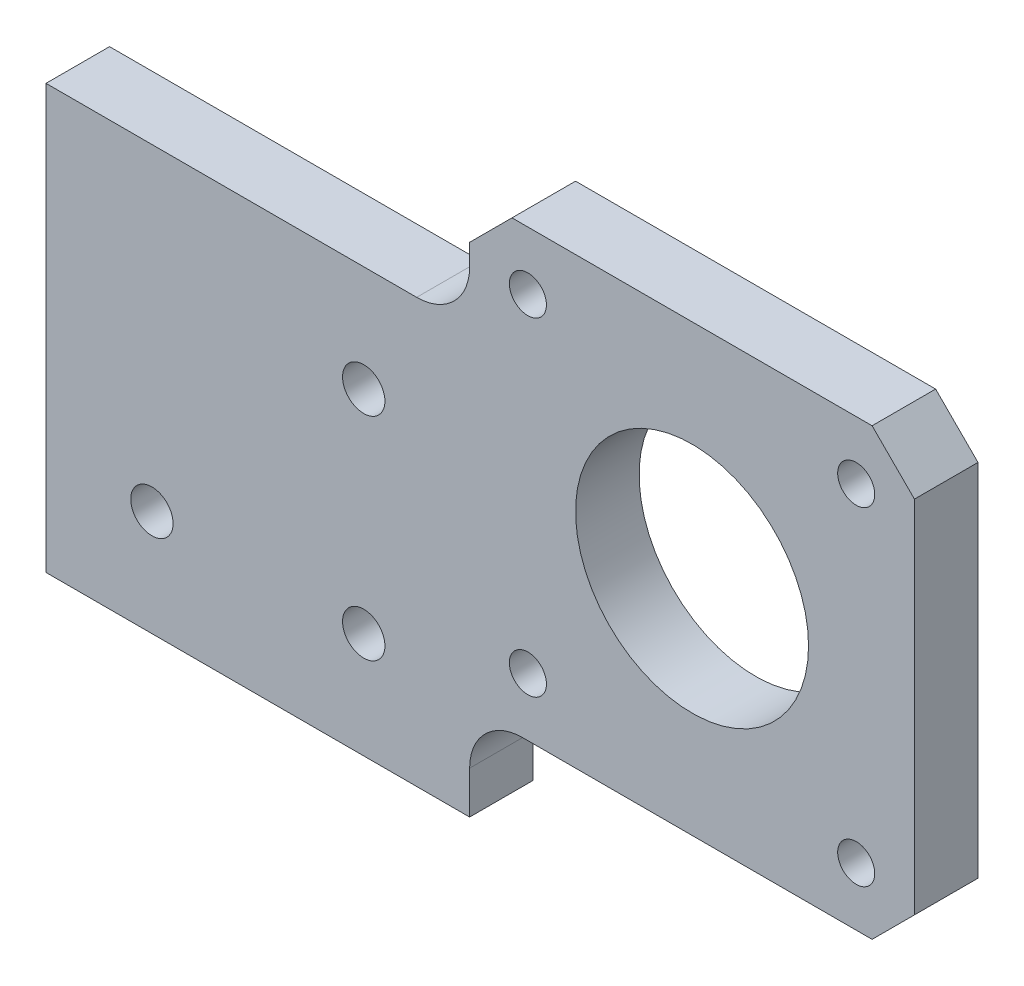
ISO-10303-21;
HEADER;
FILE_DESCRIPTION(('STEP AP214'),'2;1');
FILE_NAME('part.step','',(''),(''),'','','');
FILE_SCHEMA(('AUTOMOTIVE_DESIGN { 1 0 10303 214 1 1 1 1 }'));
ENDSEC;
DATA;
#1=APPLICATION_CONTEXT('core data for automotive mechanical design processes');
#2=APPLICATION_PROTOCOL_DEFINITION('international standard','automotive_design',2000,#1);
#3=PRODUCT_CONTEXT('',#1,'mechanical');
#4=PRODUCT('Part','Part','',(#3));
#5=PRODUCT_RELATED_PRODUCT_CATEGORY('part','',(#4));
#6=PRODUCT_DEFINITION_FORMATION('','',#4);
#7=PRODUCT_DEFINITION_CONTEXT('part definition',#1,'design');
#8=PRODUCT_DEFINITION('design','',#6,#7);
#9=PRODUCT_DEFINITION_SHAPE('','',#8);
#10=(LENGTH_UNIT() NAMED_UNIT(*) SI_UNIT(.MILLI.,.METRE.));
#11=(NAMED_UNIT(*) PLANE_ANGLE_UNIT() SI_UNIT($,.RADIAN.));
#12=(NAMED_UNIT(*) SI_UNIT($,.STERADIAN.) SOLID_ANGLE_UNIT());
#13=UNCERTAINTY_MEASURE_WITH_UNIT(LENGTH_MEASURE(1.E-05),#10,'distance_accuracy_value','');
#14=(GEOMETRIC_REPRESENTATION_CONTEXT(3) GLOBAL_UNCERTAINTY_ASSIGNED_CONTEXT((#13)) GLOBAL_UNIT_ASSIGNED_CONTEXT((#10,
#11,#12)) REPRESENTATION_CONTEXT('',''));
#15=CARTESIAN_POINT('',(0.,0.,0.));
#16=DIRECTION('',(0.,0.,1.));
#17=DIRECTION('',(1.,0.,0.));
#18=AXIS2_PLACEMENT_3D('',#15,#16,#17);
#19=CARTESIAN_POINT('',(0.,0.,6.));
#20=DIRECTION('',(0.,1.,0.));
#21=DIRECTION('',(0.,0.,1.));
#22=AXIS2_PLACEMENT_3D('',#19,#20,#21);
#23=PLANE('',#22);
#24=DIRECTION('',(1.,0.,0.));
#25=VECTOR('',#24,1.);
#26=CARTESIAN_POINT('',(0.,0.,0.));
#27=LINE('',#26,#25);
#28=CARTESIAN_POINT('',(0.,0.,0.));
#29=VERTEX_POINT('',#28);
#30=CARTESIAN_POINT('',(40.,0.,0.));
#31=VERTEX_POINT('',#30);
#32=EDGE_CURVE('E154',#29,#31,#27,.T.);
#33=ORIENTED_EDGE('',*,*,#32,.T.);
#34=DIRECTION('',(0.,0.,-1.));
#35=VECTOR('',#34,1.);
#36=CARTESIAN_POINT('',(40.,0.,6.));
#37=LINE('',#36,#35);
#38=CARTESIAN_POINT('',(40.,0.,6.));
#39=VERTEX_POINT('',#38);
#40=EDGE_CURVE('E133',#39,#31,#37,.T.);
#41=ORIENTED_EDGE('',*,*,#40,.F.);
#42=DIRECTION('',(1.,0.,0.));
#43=VECTOR('',#42,1.);
#44=CARTESIAN_POINT('',(0.,0.,6.));
#45=LINE('',#44,#43);
#46=CARTESIAN_POINT('',(0.,0.,6.));
#47=VERTEX_POINT('',#46);
#48=EDGE_CURVE('E140',#47,#39,#45,.T.);
#49=ORIENTED_EDGE('',*,*,#48,.F.);
#50=DIRECTION('',(0.,0.,-1.));
#51=VECTOR('',#50,1.);
#52=CARTESIAN_POINT('',(0.,0.,6.));
#53=LINE('',#52,#51);
#54=EDGE_CURVE('E161',#47,#29,#53,.T.);
#55=ORIENTED_EDGE('',*,*,#54,.T.);
#56=EDGE_LOOP('',(#33,#41,#49,#55));
#57=FACE_BOUND('',#56,.T.);
#58=ADVANCED_FACE('F35',(#57),#23,.F.);
#59=CARTESIAN_POINT('',(40.,0.,6.));
#60=DIRECTION('',(-1.,0.,0.));
#61=DIRECTION('',(0.,0.,1.));
#62=AXIS2_PLACEMENT_3D('',#59,#60,#61);
#63=PLANE('',#62);
#64=DIRECTION('',(0.,1.,0.));
#65=VECTOR('',#64,1.);
#66=CARTESIAN_POINT('',(40.,0.,0.));
#67=LINE('',#66,#65);
#68=CARTESIAN_POINT('',(40.,3.99999999999999,0.));
#69=VERTEX_POINT('',#68);
#70=EDGE_CURVE('E215',#31,#69,#67,.T.);
#71=ORIENTED_EDGE('',*,*,#70,.T.);
#72=DIRECTION('',(0.,0.,-1.));
#73=VECTOR('',#72,1.);
#74=CARTESIAN_POINT('',(40.,3.99999999999999,6.));
#75=LINE('',#74,#73);
#76=CARTESIAN_POINT('',(40.,3.99999999999999,6.));
#77=VERTEX_POINT('',#76);
#78=EDGE_CURVE('E136',#69,#77,#75,.F.);
#79=ORIENTED_EDGE('',*,*,#78,.T.);
#80=DIRECTION('',(0.,1.,0.));
#81=VECTOR('',#80,1.);
#82=CARTESIAN_POINT('',(40.,0.,6.));
#83=LINE('',#82,#81);
#84=EDGE_CURVE('E128',#39,#77,#83,.T.);
#85=ORIENTED_EDGE('',*,*,#84,.F.);
#86=ORIENTED_EDGE('',*,*,#40,.T.);
#87=EDGE_LOOP('',(#71,#79,#85,#86));
#88=FACE_BOUND('',#87,.T.);
#89=ADVANCED_FACE('F131',(#88),#63,.F.);
#90=CARTESIAN_POINT('',(0.,8.99999999999998,6.));
#91=DIRECTION('',(0.,1.,0.));
#92=DIRECTION('',(-1.,0.,0.));
#93=AXIS2_PLACEMENT_3D('',#90,#91,#92);
#94=PLANE('',#93);
#95=DIRECTION('',(1.,0.,0.));
#96=VECTOR('',#95,1.);
#97=CARTESIAN_POINT('',(0.,8.99999999999998,6.));
#98=LINE('',#97,#96);
#99=CARTESIAN_POINT('',(45.,8.99999999999999,6.));
#100=VERTEX_POINT('',#99);
#101=CARTESIAN_POINT('',(78.,8.99999999999999,6.));
#102=VERTEX_POINT('',#101);
#103=EDGE_CURVE('E139',#100,#102,#98,.T.);
#104=ORIENTED_EDGE('',*,*,#103,.F.);
#105=DIRECTION('',(0.,0.,-1.));
#106=VECTOR('',#105,1.);
#107=CARTESIAN_POINT('',(45.,8.99999999999999,0.));
#108=LINE('',#107,#106);
#109=CARTESIAN_POINT('',(45.,8.99999999999999,0.));
#110=VERTEX_POINT('',#109);
#111=EDGE_CURVE('E191',#100,#110,#108,.T.);
#112=ORIENTED_EDGE('',*,*,#111,.T.);
#113=DIRECTION('',(1.,0.,0.));
#114=VECTOR('',#113,1.);
#115=CARTESIAN_POINT('',(0.,8.99999999999998,0.));
#116=LINE('',#115,#114);
#117=CARTESIAN_POINT('',(78.,8.99999999999999,0.));
#118=VERTEX_POINT('',#117);
#119=EDGE_CURVE('E216',#110,#118,#116,.T.);
#120=ORIENTED_EDGE('',*,*,#119,.T.);
#121=DIRECTION('',(0.,0.,1.));
#122=VECTOR('',#121,1.);
#123=CARTESIAN_POINT('',(78.,8.99999999999999,6.));
#124=LINE('',#123,#122);
#125=EDGE_CURVE('E188',#118,#102,#124,.T.);
#126=ORIENTED_EDGE('',*,*,#125,.T.);
#127=EDGE_LOOP('',(#104,#112,#120,#126));
#128=FACE_BOUND('',#127,.T.);
#129=ADVANCED_FACE('F206',(#128),#94,.F.);
#130=CARTESIAN_POINT('',(82.,0.,6.));
#131=DIRECTION('',(-1.,0.,0.));
#132=DIRECTION('',(0.,-1.,0.));
#133=AXIS2_PLACEMENT_3D('',#130,#131,#132);
#134=PLANE('',#133);
#135=DIRECTION('',(0.,1.,0.));
#136=VECTOR('',#135,1.);
#137=CARTESIAN_POINT('',(82.,0.,6.));
#138=LINE('',#137,#136);
#139=CARTESIAN_POINT('',(82.,13.,6.));
#140=VERTEX_POINT('',#139);
#141=CARTESIAN_POINT('',(82.,47.,6.));
#142=VERTEX_POINT('',#141);
#143=EDGE_CURVE('E210',#140,#142,#138,.T.);
#144=ORIENTED_EDGE('',*,*,#143,.F.);
#145=DIRECTION('',(0.,0.,-1.));
#146=VECTOR('',#145,1.);
#147=CARTESIAN_POINT('',(82.,13.,6.));
#148=LINE('',#147,#146);
#149=CARTESIAN_POINT('',(82.,13.,0.));
#150=VERTEX_POINT('',#149);
#151=EDGE_CURVE('E185',#140,#150,#148,.T.);
#152=ORIENTED_EDGE('',*,*,#151,.T.);
#153=DIRECTION('',(0.,1.,0.));
#154=VECTOR('',#153,1.);
#155=CARTESIAN_POINT('',(82.,0.,0.));
#156=LINE('',#155,#154);
#157=CARTESIAN_POINT('',(82.,47.,0.));
#158=VERTEX_POINT('',#157);
#159=EDGE_CURVE('E218',#150,#158,#156,.T.);
#160=ORIENTED_EDGE('',*,*,#159,.T.);
#161=DIRECTION('',(0.,0.,1.));
#162=VECTOR('',#161,1.);
#163=CARTESIAN_POINT('',(82.,47.,6.));
#164=LINE('',#163,#162);
#165=EDGE_CURVE('E183',#158,#142,#164,.T.);
#166=ORIENTED_EDGE('',*,*,#165,.T.);
#167=EDGE_LOOP('',(#144,#152,#160,#166));
#168=FACE_BOUND('',#167,.T.);
#169=ADVANCED_FACE('F298',(#168),#134,.F.);
#170=CARTESIAN_POINT('',(0.,51.,6.));
#171=DIRECTION('',(0.,1.,0.));
#172=DIRECTION('',(0.,0.,1.));
#173=AXIS2_PLACEMENT_3D('',#170,#171,#172);
#174=PLANE('',#173);
#175=DIRECTION('',(1.,0.,0.));
#176=VECTOR('',#175,1.);
#177=CARTESIAN_POINT('',(0.,51.,0.));
#178=LINE('',#177,#176);
#179=CARTESIAN_POINT('',(44.,51.,0.));
#180=VERTEX_POINT('',#179);
#181=CARTESIAN_POINT('',(77.9999999999999,51.,0.));
#182=VERTEX_POINT('',#181);
#183=EDGE_CURVE('E226',#180,#182,#178,.T.);
#184=ORIENTED_EDGE('',*,*,#183,.F.);
#185=DIRECTION('',(0.,0.,1.));
#186=VECTOR('',#185,1.);
#187=CARTESIAN_POINT('',(44.,51.,6.));
#188=LINE('',#187,#186);
#189=CARTESIAN_POINT('',(44.,51.,6.));
#190=VERTEX_POINT('',#189);
#191=EDGE_CURVE('E174',#180,#190,#188,.T.);
#192=ORIENTED_EDGE('',*,*,#191,.T.);
#193=DIRECTION('',(1.,0.,0.));
#194=VECTOR('',#193,1.);
#195=CARTESIAN_POINT('',(0.,51.,6.));
#196=LINE('',#195,#194);
#197=CARTESIAN_POINT('',(77.9999999999999,51.,6.));
#198=VERTEX_POINT('',#197);
#199=EDGE_CURVE('E353',#190,#198,#196,.T.);
#200=ORIENTED_EDGE('',*,*,#199,.T.);
#201=DIRECTION('',(0.,0.,-1.));
#202=VECTOR('',#201,1.);
#203=CARTESIAN_POINT('',(77.9999999999999,51.,0.));
#204=LINE('',#203,#202);
#205=EDGE_CURVE('E171',#198,#182,#204,.T.);
#206=ORIENTED_EDGE('',*,*,#205,.T.);
#207=EDGE_LOOP('',(#184,#192,#200,#206));
#208=FACE_BOUND('',#207,.T.);
#209=ADVANCED_FACE('F301',(#208),#174,.T.);
#210=CARTESIAN_POINT('',(40.,0.,6.));
#211=DIRECTION('',(-1.,0.,0.));
#212=DIRECTION('',(0.,-1.,0.));
#213=AXIS2_PLACEMENT_3D('',#210,#211,#212);
#214=PLANE('',#213);
#215=DIRECTION('',(0.,1.,0.));
#216=VECTOR('',#215,1.);
#217=CARTESIAN_POINT('',(40.,0.,0.));
#218=LINE('',#217,#216);
#219=CARTESIAN_POINT('',(40.,45.,0.));
#220=VERTEX_POINT('',#219);
#221=CARTESIAN_POINT('',(40.,47.,0.));
#222=VERTEX_POINT('',#221);
#223=EDGE_CURVE('E229',#220,#222,#218,.T.);
#224=ORIENTED_EDGE('',*,*,#223,.F.);
#225=DIRECTION('',(0.,0.,-1.));
#226=VECTOR('',#225,1.);
#227=CARTESIAN_POINT('',(40.,45.,6.));
#228=LINE('',#227,#226);
#229=CARTESIAN_POINT('',(40.,45.,6.));
#230=VERTEX_POINT('',#229);
#231=EDGE_CURVE('E56',#220,#230,#228,.F.);
#232=ORIENTED_EDGE('',*,*,#231,.T.);
#233=DIRECTION('',(0.,1.,0.));
#234=VECTOR('',#233,1.);
#235=CARTESIAN_POINT('',(40.,0.,6.));
#236=LINE('',#235,#234);
#237=CARTESIAN_POINT('',(40.,47.,6.));
#238=VERTEX_POINT('',#237);
#239=EDGE_CURVE('E356',#230,#238,#236,.T.);
#240=ORIENTED_EDGE('',*,*,#239,.T.);
#241=DIRECTION('',(0.,0.,-1.));
#242=VECTOR('',#241,1.);
#243=CARTESIAN_POINT('',(40.,47.,6.));
#244=LINE('',#243,#242);
#245=EDGE_CURVE('E155',#238,#222,#244,.T.);
#246=ORIENTED_EDGE('',*,*,#245,.T.);
#247=EDGE_LOOP('',(#224,#232,#240,#246));
#248=FACE_BOUND('',#247,.T.);
#249=ADVANCED_FACE('F305',(#248),#214,.T.);
#250=CARTESIAN_POINT('',(0.,40.,6.));
#251=DIRECTION('',(0.,1.,0.));
#252=DIRECTION('',(0.,0.,1.));
#253=AXIS2_PLACEMENT_3D('',#250,#251,#252);
#254=PLANE('',#253);
#255=DIRECTION('',(1.,0.,0.));
#256=VECTOR('',#255,1.);
#257=CARTESIAN_POINT('',(0.,40.,6.));
#258=LINE('',#257,#256);
#259=CARTESIAN_POINT('',(0.,40.,6.));
#260=VERTEX_POINT('',#259);
#261=CARTESIAN_POINT('',(35.,40.,6.));
#262=VERTEX_POINT('',#261);
#263=EDGE_CURVE('E358',#260,#262,#258,.T.);
#264=ORIENTED_EDGE('',*,*,#263,.T.);
#265=DIRECTION('',(0.,0.,-1.));
#266=VECTOR('',#265,1.);
#267=CARTESIAN_POINT('',(35.,40.,0.));
#268=LINE('',#267,#266);
#269=CARTESIAN_POINT('',(35.,40.,0.));
#270=VERTEX_POINT('',#269);
#271=EDGE_CURVE('E195',#262,#270,#268,.T.);
#272=ORIENTED_EDGE('',*,*,#271,.T.);
#273=DIRECTION('',(1.,0.,0.));
#274=VECTOR('',#273,1.);
#275=CARTESIAN_POINT('',(0.,40.,0.));
#276=LINE('',#275,#274);
#277=CARTESIAN_POINT('',(0.,40.,0.));
#278=VERTEX_POINT('',#277);
#279=EDGE_CURVE('E231',#278,#270,#276,.T.);
#280=ORIENTED_EDGE('',*,*,#279,.F.);
#281=DIRECTION('',(0.,0.,-1.));
#282=VECTOR('',#281,1.);
#283=CARTESIAN_POINT('',(0.,40.,6.));
#284=LINE('',#283,#282);
#285=EDGE_CURVE('E156',#260,#278,#284,.T.);
#286=ORIENTED_EDGE('',*,*,#285,.F.);
#287=EDGE_LOOP('',(#264,#272,#280,#286));
#288=FACE_BOUND('',#287,.T.);
#289=ADVANCED_FACE('F309',(#288),#254,.T.);
#290=CARTESIAN_POINT('',(76.5,45.5,6.));
#291=DIRECTION('',(0.,0.,-1.));
#292=DIRECTION('',(-1.,0.,0.));
#293=AXIS2_PLACEMENT_3D('',#290,#291,#292);
#294=CYLINDRICAL_SURFACE('',#293,1.75);
#295=CARTESIAN_POINT('',(76.5,45.5,6.));
#296=DIRECTION('',(0.,0.,1.));
#297=DIRECTION('',(1.,0.,0.));
#298=AXIS2_PLACEMENT_3D('',#295,#296,#297);
#299=CIRCLE('',#298,1.75);
#300=CARTESIAN_POINT('',(78.25,45.5,6.));
#301=VERTEX_POINT('',#300);
#302=EDGE_CURVE('E253',#301,#301,#299,.T.);
#303=ORIENTED_EDGE('',*,*,#302,.T.);
#304=EDGE_LOOP('',(#303));
#305=FACE_BOUND('',#304,.T.);
#306=CARTESIAN_POINT('',(76.5,45.5,0.));
#307=DIRECTION('',(0.,0.,1.));
#308=DIRECTION('',(1.,0.,0.));
#309=AXIS2_PLACEMENT_3D('',#306,#307,#308);
#310=CIRCLE('',#309,1.75);
#311=CARTESIAN_POINT('',(78.25,45.5,0.));
#312=VERTEX_POINT('',#311);
#313=EDGE_CURVE('E245',#312,#312,#310,.T.);
#314=ORIENTED_EDGE('',*,*,#313,.F.);
#315=EDGE_LOOP('',(#314));
#316=FACE_BOUND('',#315,.T.);
#317=ADVANCED_FACE('F311',(#305,#316),#294,.F.);
#318=CARTESIAN_POINT('',(76.5,14.5,6.));
#319=DIRECTION('',(0.,0.,-1.));
#320=DIRECTION('',(-1.,0.,0.));
#321=AXIS2_PLACEMENT_3D('',#318,#319,#320);
#322=CYLINDRICAL_SURFACE('',#321,1.75);
#323=CARTESIAN_POINT('',(76.5,14.5,6.));
#324=DIRECTION('',(0.,0.,1.));
#325=DIRECTION('',(1.,0.,0.));
#326=AXIS2_PLACEMENT_3D('',#323,#324,#325);
#327=CIRCLE('',#326,1.75);
#328=CARTESIAN_POINT('',(78.25,14.5,6.));
#329=VERTEX_POINT('',#328);
#330=EDGE_CURVE('E258',#329,#329,#327,.T.);
#331=ORIENTED_EDGE('',*,*,#330,.T.);
#332=EDGE_LOOP('',(#331));
#333=FACE_BOUND('',#332,.T.);
#334=CARTESIAN_POINT('',(76.5,14.5,0.));
#335=DIRECTION('',(0.,0.,1.));
#336=DIRECTION('',(1.,0.,0.));
#337=AXIS2_PLACEMENT_3D('',#334,#335,#336);
#338=CIRCLE('',#337,1.75);
#339=CARTESIAN_POINT('',(78.25,14.5,0.));
#340=VERTEX_POINT('',#339);
#341=EDGE_CURVE('E242',#340,#340,#338,.T.);
#342=ORIENTED_EDGE('',*,*,#341,.F.);
#343=EDGE_LOOP('',(#342));
#344=FACE_BOUND('',#343,.T.);
#345=ADVANCED_FACE('F320',(#333,#344),#322,.F.);
#346=CARTESIAN_POINT('',(45.5,14.5,6.));
#347=DIRECTION('',(0.,0.,-1.));
#348=DIRECTION('',(-1.,0.,0.));
#349=AXIS2_PLACEMENT_3D('',#346,#347,#348);
#350=CYLINDRICAL_SURFACE('',#349,1.75);
#351=CARTESIAN_POINT('',(45.5,14.5,6.));
#352=DIRECTION('',(0.,0.,1.));
#353=DIRECTION('',(1.,0.,0.));
#354=AXIS2_PLACEMENT_3D('',#351,#352,#353);
#355=CIRCLE('',#354,1.75);
#356=CARTESIAN_POINT('',(47.25,14.5,6.));
#357=VERTEX_POINT('',#356);
#358=EDGE_CURVE('E365',#357,#357,#355,.T.);
#359=ORIENTED_EDGE('',*,*,#358,.T.);
#360=EDGE_LOOP('',(#359));
#361=FACE_BOUND('',#360,.T.);
#362=CARTESIAN_POINT('',(45.5,14.5,0.));
#363=DIRECTION('',(0.,0.,1.));
#364=DIRECTION('',(1.,0.,0.));
#365=AXIS2_PLACEMENT_3D('',#362,#363,#364);
#366=CIRCLE('',#365,1.75);
#367=CARTESIAN_POINT('',(47.25,14.5,0.));
#368=VERTEX_POINT('',#367);
#369=EDGE_CURVE('E239',#368,#368,#366,.T.);
#370=ORIENTED_EDGE('',*,*,#369,.F.);
#371=EDGE_LOOP('',(#370));
#372=FACE_BOUND('',#371,.T.);
#373=ADVANCED_FACE('F316',(#361,#372),#350,.F.);
#374=CARTESIAN_POINT('',(61.,30.,6.));
#375=DIRECTION('',(0.,0.,-1.));
#376=DIRECTION('',(-1.,0.,0.));
#377=AXIS2_PLACEMENT_3D('',#374,#375,#376);
#378=CYLINDRICAL_SURFACE('',#377,11.);
#379=CARTESIAN_POINT('',(61.,30.,6.));
#380=DIRECTION('',(0.,0.,1.));
#381=DIRECTION('',(1.,0.,0.));
#382=AXIS2_PLACEMENT_3D('',#379,#380,#381);
#383=CIRCLE('',#382,11.);
#384=CARTESIAN_POINT('',(72.,30.,6.));
#385=VERTEX_POINT('',#384);
#386=EDGE_CURVE('E362',#385,#385,#383,.T.);
#387=ORIENTED_EDGE('',*,*,#386,.T.);
#388=EDGE_LOOP('',(#387));
#389=FACE_BOUND('',#388,.T.);
#390=CARTESIAN_POINT('',(61.,30.,0.));
#391=DIRECTION('',(0.,0.,1.));
#392=DIRECTION('',(1.,0.,0.));
#393=AXIS2_PLACEMENT_3D('',#390,#391,#392);
#394=CIRCLE('',#393,11.);
#395=CARTESIAN_POINT('',(72.,30.,0.));
#396=VERTEX_POINT('',#395);
#397=EDGE_CURVE('E236',#396,#396,#394,.T.);
#398=ORIENTED_EDGE('',*,*,#397,.F.);
#399=EDGE_LOOP('',(#398));
#400=FACE_BOUND('',#399,.T.);
#401=ADVANCED_FACE('F284',(#389,#400),#378,.F.);
#402=CARTESIAN_POINT('',(0.,0.,6.));
#403=DIRECTION('',(-1.,0.,0.));
#404=DIRECTION('',(0.,0.,1.));
#405=AXIS2_PLACEMENT_3D('',#402,#403,#404);
#406=PLANE('',#405);
#407=DIRECTION('',(0.,1.,0.));
#408=VECTOR('',#407,1.);
#409=CARTESIAN_POINT('',(0.,0.,0.));
#410=LINE('',#409,#408);
#411=EDGE_CURVE('E233',#29,#278,#410,.T.);
#412=ORIENTED_EDGE('',*,*,#411,.F.);
#413=ORIENTED_EDGE('',*,*,#54,.F.);
#414=DIRECTION('',(0.,1.,0.));
#415=VECTOR('',#414,1.);
#416=CARTESIAN_POINT('',(0.,0.,6.));
#417=LINE('',#416,#415);
#418=EDGE_CURVE('E149',#47,#260,#417,.T.);
#419=ORIENTED_EDGE('',*,*,#418,.T.);
#420=ORIENTED_EDGE('',*,*,#285,.T.);
#421=EDGE_LOOP('',(#412,#413,#419,#420));
#422=FACE_BOUND('',#421,.T.);
#423=ADVANCED_FACE('F274',(#422),#406,.T.);
#424=CARTESIAN_POINT('',(30.,10.,6.));
#425=DIRECTION('',(0.,0.,-1.));
#426=DIRECTION('',(-1.,0.,0.));
#427=AXIS2_PLACEMENT_3D('',#424,#425,#426);
#428=CYLINDRICAL_SURFACE('',#427,2.);
#429=CARTESIAN_POINT('',(30.,10.,6.));
#430=DIRECTION('',(0.,0.,1.));
#431=DIRECTION('',(1.,0.,0.));
#432=AXIS2_PLACEMENT_3D('',#429,#430,#431);
#433=CIRCLE('',#432,2.);
#434=CARTESIAN_POINT('',(32.,10.,6.));
#435=VERTEX_POINT('',#434);
#436=EDGE_CURVE('E151',#435,#435,#433,.T.);
#437=ORIENTED_EDGE('',*,*,#436,.T.);
#438=EDGE_LOOP('',(#437));
#439=FACE_BOUND('',#438,.T.);
#440=CARTESIAN_POINT('',(30.,10.,0.));
#441=DIRECTION('',(0.,0.,1.));
#442=DIRECTION('',(1.,0.,0.));
#443=AXIS2_PLACEMENT_3D('',#440,#441,#442);
#444=CIRCLE('',#443,2.);
#445=CARTESIAN_POINT('',(32.,10.,0.));
#446=VERTEX_POINT('',#445);
#447=EDGE_CURVE('E220',#446,#446,#444,.T.);
#448=ORIENTED_EDGE('',*,*,#447,.F.);
#449=EDGE_LOOP('',(#448));
#450=FACE_BOUND('',#449,.T.);
#451=ADVANCED_FACE('F271',(#439,#450),#428,.F.);
#452=CARTESIAN_POINT('',(10.,10.,6.));
#453=DIRECTION('',(0.,0.,-1.));
#454=DIRECTION('',(-1.,0.,0.));
#455=AXIS2_PLACEMENT_3D('',#452,#453,#454);
#456=CYLINDRICAL_SURFACE('',#455,2.);
#457=CARTESIAN_POINT('',(10.,10.,6.));
#458=DIRECTION('',(0.,0.,1.));
#459=DIRECTION('',(1.,0.,0.));
#460=AXIS2_PLACEMENT_3D('',#457,#458,#459);
#461=CIRCLE('',#460,2.);
#462=CARTESIAN_POINT('',(12.,10.,6.));
#463=VERTEX_POINT('',#462);
#464=EDGE_CURVE('E345',#463,#463,#461,.T.);
#465=ORIENTED_EDGE('',*,*,#464,.T.);
#466=EDGE_LOOP('',(#465));
#467=FACE_BOUND('',#466,.T.);
#468=CARTESIAN_POINT('',(10.,10.,0.));
#469=DIRECTION('',(0.,0.,1.));
#470=DIRECTION('',(1.,0.,0.));
#471=AXIS2_PLACEMENT_3D('',#468,#469,#470);
#472=CIRCLE('',#471,2.);
#473=CARTESIAN_POINT('',(12.,10.,0.));
#474=VERTEX_POINT('',#473);
#475=EDGE_CURVE('E265',#474,#474,#472,.T.);
#476=ORIENTED_EDGE('',*,*,#475,.F.);
#477=EDGE_LOOP('',(#476));
#478=FACE_BOUND('',#477,.T.);
#479=ADVANCED_FACE('F273',(#467,#478),#456,.F.);
#480=CARTESIAN_POINT('',(30.,30.,6.));
#481=DIRECTION('',(0.,0.,-1.));
#482=DIRECTION('',(-1.,0.,0.));
#483=AXIS2_PLACEMENT_3D('',#480,#481,#482);
#484=CYLINDRICAL_SURFACE('',#483,2.);
#485=CARTESIAN_POINT('',(30.,30.,6.));
#486=DIRECTION('',(0.,0.,1.));
#487=DIRECTION('',(1.,0.,0.));
#488=AXIS2_PLACEMENT_3D('',#485,#486,#487);
#489=CIRCLE('',#488,2.);
#490=CARTESIAN_POINT('',(32.,30.,6.));
#491=VERTEX_POINT('',#490);
#492=EDGE_CURVE('E250',#491,#491,#489,.T.);
#493=ORIENTED_EDGE('',*,*,#492,.T.);
#494=EDGE_LOOP('',(#493));
#495=FACE_BOUND('',#494,.T.);
#496=CARTESIAN_POINT('',(30.,30.,0.));
#497=DIRECTION('',(0.,0.,1.));
#498=DIRECTION('',(1.,0.,0.));
#499=AXIS2_PLACEMENT_3D('',#496,#497,#498);
#500=CIRCLE('',#499,2.);
#501=CARTESIAN_POINT('',(32.,30.,0.));
#502=VERTEX_POINT('',#501);
#503=EDGE_CURVE('E262',#502,#502,#500,.T.);
#504=ORIENTED_EDGE('',*,*,#503,.F.);
#505=EDGE_LOOP('',(#504));
#506=FACE_BOUND('',#505,.T.);
#507=ADVANCED_FACE('F281',(#495,#506),#484,.F.);
#508=CARTESIAN_POINT('',(45.5,45.5,6.));
#509=DIRECTION('',(0.,0.,-1.));
#510=DIRECTION('',(-1.,0.,0.));
#511=AXIS2_PLACEMENT_3D('',#508,#509,#510);
#512=CYLINDRICAL_SURFACE('',#511,1.75);
#513=CARTESIAN_POINT('',(45.5,45.5,6.));
#514=DIRECTION('',(0.,0.,1.));
#515=DIRECTION('',(1.,0.,0.));
#516=AXIS2_PLACEMENT_3D('',#513,#514,#515);
#517=CIRCLE('',#516,1.75);
#518=CARTESIAN_POINT('',(47.25,45.5,6.));
#519=VERTEX_POINT('',#518);
#520=EDGE_CURVE('E251',#519,#519,#517,.T.);
#521=ORIENTED_EDGE('',*,*,#520,.T.);
#522=EDGE_LOOP('',(#521));
#523=FACE_BOUND('',#522,.T.);
#524=CARTESIAN_POINT('',(45.5,45.5,0.));
#525=DIRECTION('',(0.,0.,1.));
#526=DIRECTION('',(1.,0.,0.));
#527=AXIS2_PLACEMENT_3D('',#524,#525,#526);
#528=CIRCLE('',#527,1.75);
#529=CARTESIAN_POINT('',(47.25,45.5,0.));
#530=VERTEX_POINT('',#529);
#531=EDGE_CURVE('E248',#530,#530,#528,.T.);
#532=ORIENTED_EDGE('',*,*,#531,.F.);
#533=EDGE_LOOP('',(#532));
#534=FACE_BOUND('',#533,.T.);
#535=ADVANCED_FACE('F328',(#523,#534),#512,.F.);
#536=CARTESIAN_POINT('',(0.,0.,6.));
#537=DIRECTION('',(0.,0.,1.));
#538=DIRECTION('',(1.,0.,0.));
#539=AXIS2_PLACEMENT_3D('',#536,#537,#538);
#540=PLANE('',#539);
#541=ORIENTED_EDGE('',*,*,#492,.F.);
#542=EDGE_LOOP('',(#541));
#543=FACE_BOUND('',#542,.T.);
#544=ORIENTED_EDGE('',*,*,#464,.F.);
#545=EDGE_LOOP('',(#544));
#546=FACE_BOUND('',#545,.T.);
#547=ORIENTED_EDGE('',*,*,#436,.F.);
#548=EDGE_LOOP('',(#547));
#549=FACE_BOUND('',#548,.T.);
#550=ORIENTED_EDGE('',*,*,#199,.F.);
#551=DIRECTION('',(0.707106781186549,0.707106781186546,0.));
#552=VECTOR('',#551,1.);
#553=CARTESIAN_POINT('',(-3.50000000000009,3.5000000000001,6.));
#554=LINE('',#553,#552);
#555=EDGE_CURVE('E180',#190,#238,#554,.F.);
#556=ORIENTED_EDGE('',*,*,#555,.T.);
#557=ORIENTED_EDGE('',*,*,#239,.F.);
#558=CARTESIAN_POINT('',(35.,45.,6.));
#559=DIRECTION('',(0.,0.,1.));
#560=DIRECTION('',(1.,0.,0.));
#561=AXIS2_PLACEMENT_3D('',#558,#559,#560);
#562=CIRCLE('',#561,5.);
#563=EDGE_CURVE('E11',#230,#262,#562,.F.);
#564=ORIENTED_EDGE('',*,*,#563,.T.);
#565=ORIENTED_EDGE('',*,*,#263,.F.);
#566=ORIENTED_EDGE('',*,*,#418,.F.);
#567=ORIENTED_EDGE('',*,*,#48,.T.);
#568=ORIENTED_EDGE('',*,*,#84,.T.);
#569=CARTESIAN_POINT('',(45.,3.99999999999999,6.));
#570=DIRECTION('',(0.,0.,1.));
#571=DIRECTION('',(1.,0.,0.));
#572=AXIS2_PLACEMENT_3D('',#569,#570,#571);
#573=CIRCLE('',#572,5.);
#574=EDGE_CURVE('E201',#77,#100,#573,.F.);
#575=ORIENTED_EDGE('',*,*,#574,.T.);
#576=ORIENTED_EDGE('',*,*,#103,.T.);
#577=DIRECTION('',(-0.707106781186549,-0.707106781186546,0.));
#578=VECTOR('',#577,1.);
#579=CARTESIAN_POINT('',(34.4999999999999,-34.5,6.));
#580=LINE('',#579,#578);
#581=EDGE_CURVE('E178',#102,#140,#580,.F.);
#582=ORIENTED_EDGE('',*,*,#581,.T.);
#583=ORIENTED_EDGE('',*,*,#143,.T.);
#584=DIRECTION('',(-0.707106781186546,0.707106781186549,0.));
#585=VECTOR('',#584,1.);
#586=CARTESIAN_POINT('',(64.5000000000001,64.4999999999999,6.));
#587=LINE('',#586,#585);
#588=EDGE_CURVE('E176',#142,#198,#587,.T.);
#589=ORIENTED_EDGE('',*,*,#588,.T.);
#590=EDGE_LOOP('',(#550,#556,#557,#564,#565,#566,#567,#568,#575,#576,#582,#583,#589));
#591=FACE_BOUND('',#590,.T.);
#592=ORIENTED_EDGE('',*,*,#386,.F.);
#593=EDGE_LOOP('',(#592));
#594=FACE_BOUND('',#593,.T.);
#595=ORIENTED_EDGE('',*,*,#358,.F.);
#596=EDGE_LOOP('',(#595));
#597=FACE_BOUND('',#596,.T.);
#598=ORIENTED_EDGE('',*,*,#330,.F.);
#599=EDGE_LOOP('',(#598));
#600=FACE_BOUND('',#599,.T.);
#601=ORIENTED_EDGE('',*,*,#302,.F.);
#602=EDGE_LOOP('',(#601));
#603=FACE_BOUND('',#602,.T.);
#604=ORIENTED_EDGE('',*,*,#520,.F.);
#605=EDGE_LOOP('',(#604));
#606=FACE_BOUND('',#605,.T.);
#607=ADVANCED_FACE('F145',(#543,#546,#549,#591,#594,#597,#600,#603,#606),#540,.T.);
#608=CARTESIAN_POINT('',(0.,0.,0.));
#609=DIRECTION('',(0.,0.,1.));
#610=DIRECTION('',(1.,0.,0.));
#611=AXIS2_PLACEMENT_3D('',#608,#609,#610);
#612=PLANE('',#611);
#613=ORIENTED_EDGE('',*,*,#503,.T.);
#614=EDGE_LOOP('',(#613));
#615=FACE_BOUND('',#614,.T.);
#616=ORIENTED_EDGE('',*,*,#475,.T.);
#617=EDGE_LOOP('',(#616));
#618=FACE_BOUND('',#617,.T.);
#619=ORIENTED_EDGE('',*,*,#447,.T.);
#620=EDGE_LOOP('',(#619));
#621=FACE_BOUND('',#620,.T.);
#622=ORIENTED_EDGE('',*,*,#279,.T.);
#623=CARTESIAN_POINT('',(35.,45.,0.));
#624=DIRECTION('',(0.,0.,1.));
#625=DIRECTION('',(1.,0.,0.));
#626=AXIS2_PLACEMENT_3D('',#623,#624,#625);
#627=CIRCLE('',#626,5.);
#628=EDGE_CURVE('E43',#270,#220,#627,.T.);
#629=ORIENTED_EDGE('',*,*,#628,.T.);
#630=ORIENTED_EDGE('',*,*,#223,.T.);
#631=DIRECTION('',(-0.707106781186549,-0.707106781186546,0.));
#632=VECTOR('',#631,1.);
#633=CARTESIAN_POINT('',(40.,47.,0.));
#634=LINE('',#633,#632);
#635=EDGE_CURVE('E169',#222,#180,#634,.F.);
#636=ORIENTED_EDGE('',*,*,#635,.T.);
#637=ORIENTED_EDGE('',*,*,#183,.T.);
#638=DIRECTION('',(0.707106781186546,-0.707106781186549,0.));
#639=VECTOR('',#638,1.);
#640=CARTESIAN_POINT('',(77.9999999999999,51.,0.));
#641=LINE('',#640,#639);
#642=EDGE_CURVE('E159',#182,#158,#641,.T.);
#643=ORIENTED_EDGE('',*,*,#642,.T.);
#644=ORIENTED_EDGE('',*,*,#159,.F.);
#645=DIRECTION('',(0.707106781186549,0.707106781186546,0.));
#646=VECTOR('',#645,1.);
#647=CARTESIAN_POINT('',(82.,13.,0.));
#648=LINE('',#647,#646);
#649=EDGE_CURVE('E166',#150,#118,#648,.F.);
#650=ORIENTED_EDGE('',*,*,#649,.T.);
#651=ORIENTED_EDGE('',*,*,#119,.F.);
#652=CARTESIAN_POINT('',(45.,3.99999999999999,0.));
#653=DIRECTION('',(0.,0.,1.));
#654=DIRECTION('',(1.,0.,0.));
#655=AXIS2_PLACEMENT_3D('',#652,#653,#654);
#656=CIRCLE('',#655,5.);
#657=EDGE_CURVE('E199',#110,#69,#656,.T.);
#658=ORIENTED_EDGE('',*,*,#657,.T.);
#659=ORIENTED_EDGE('',*,*,#70,.F.);
#660=ORIENTED_EDGE('',*,*,#32,.F.);
#661=ORIENTED_EDGE('',*,*,#411,.T.);
#662=EDGE_LOOP('',(#622,#629,#630,#636,#637,#643,#644,#650,#651,#658,#659,#660,#661));
#663=FACE_BOUND('',#662,.T.);
#664=ORIENTED_EDGE('',*,*,#397,.T.);
#665=EDGE_LOOP('',(#664));
#666=FACE_BOUND('',#665,.T.);
#667=ORIENTED_EDGE('',*,*,#369,.T.);
#668=EDGE_LOOP('',(#667));
#669=FACE_BOUND('',#668,.T.);
#670=ORIENTED_EDGE('',*,*,#341,.T.);
#671=EDGE_LOOP('',(#670));
#672=FACE_BOUND('',#671,.T.);
#673=ORIENTED_EDGE('',*,*,#313,.T.);
#674=EDGE_LOOP('',(#673));
#675=FACE_BOUND('',#674,.T.);
#676=ORIENTED_EDGE('',*,*,#531,.T.);
#677=EDGE_LOOP('',(#676));
#678=FACE_BOUND('',#677,.T.);
#679=ADVANCED_FACE('F213',(#615,#618,#621,#663,#666,#669,#672,#675,#678),#612,.F.);
#680=CARTESIAN_POINT('',(40.,47.,6.));
#681=DIRECTION('',(0.707106781186546,-0.707106781186549,0.));
#682=DIRECTION('',(0.,0.,-1.));
#683=AXIS2_PLACEMENT_3D('',#680,#681,#682);
#684=PLANE('',#683);
#685=ORIENTED_EDGE('',*,*,#555,.F.);
#686=ORIENTED_EDGE('',*,*,#191,.F.);
#687=ORIENTED_EDGE('',*,*,#635,.F.);
#688=ORIENTED_EDGE('',*,*,#245,.F.);
#689=EDGE_LOOP('',(#685,#686,#687,#688));
#690=FACE_BOUND('',#689,.T.);
#691=ADVANCED_FACE('F333',(#690),#684,.F.);
#692=CARTESIAN_POINT('',(82.,13.,6.));
#693=DIRECTION('',(-0.707106781186546,0.707106781186549,0.));
#694=DIRECTION('',(0.,0.,-1.));
#695=AXIS2_PLACEMENT_3D('',#692,#693,#694);
#696=PLANE('',#695);
#697=ORIENTED_EDGE('',*,*,#581,.F.);
#698=ORIENTED_EDGE('',*,*,#125,.F.);
#699=ORIENTED_EDGE('',*,*,#649,.F.);
#700=ORIENTED_EDGE('',*,*,#151,.F.);
#701=EDGE_LOOP('',(#697,#698,#699,#700));
#702=FACE_BOUND('',#701,.T.);
#703=ADVANCED_FACE('F410',(#702),#696,.F.);
#704=CARTESIAN_POINT('',(77.9999999999999,51.,6.));
#705=DIRECTION('',(0.707106781186549,0.707106781186546,0.));
#706=DIRECTION('',(0.,0.,1.));
#707=AXIS2_PLACEMENT_3D('',#704,#705,#706);
#708=PLANE('',#707);
#709=ORIENTED_EDGE('',*,*,#588,.F.);
#710=ORIENTED_EDGE('',*,*,#165,.F.);
#711=ORIENTED_EDGE('',*,*,#642,.F.);
#712=ORIENTED_EDGE('',*,*,#205,.F.);
#713=EDGE_LOOP('',(#709,#710,#711,#712));
#714=FACE_BOUND('',#713,.T.);
#715=ADVANCED_FACE('F404',(#714),#708,.T.);
#716=CARTESIAN_POINT('',(45.,3.99999999999999,6.));
#717=DIRECTION('',(0.,0.,1.));
#718=DIRECTION('',(1.,0.,0.));
#719=AXIS2_PLACEMENT_3D('',#716,#717,#718);
#720=CYLINDRICAL_SURFACE('',#719,5.);
#721=ORIENTED_EDGE('',*,*,#574,.F.);
#722=ORIENTED_EDGE('',*,*,#78,.F.);
#723=ORIENTED_EDGE('',*,*,#657,.F.);
#724=ORIENTED_EDGE('',*,*,#111,.F.);
#725=EDGE_LOOP('',(#721,#722,#723,#724));
#726=FACE_BOUND('',#725,.T.);
#727=ADVANCED_FACE('F212',(#726),#720,.F.);
#728=CARTESIAN_POINT('',(35.,45.,6.));
#729=DIRECTION('',(0.,0.,1.));
#730=DIRECTION('',(1.,0.,0.));
#731=AXIS2_PLACEMENT_3D('',#728,#729,#730);
#732=CYLINDRICAL_SURFACE('',#731,5.);
#733=ORIENTED_EDGE('',*,*,#563,.F.);
#734=ORIENTED_EDGE('',*,*,#231,.F.);
#735=ORIENTED_EDGE('',*,*,#628,.F.);
#736=ORIENTED_EDGE('',*,*,#271,.F.);
#737=EDGE_LOOP('',(#733,#734,#735,#736));
#738=FACE_BOUND('',#737,.T.);
#739=ADVANCED_FACE('F37',(#738),#732,.F.);
#740=CLOSED_SHELL('',(#58,#89,#129,#169,#209,#249,#289,#317,#345,#373,#401,#423,#451,#479,#507,
#535,#607,#679,#691,#703,#715,#727,#739));
#741=MANIFOLD_SOLID_BREP('B2',#740);
#742=ADVANCED_BREP_SHAPE_REPRESENTATION('',(#18,#741),#14);
#743=SHAPE_DEFINITION_REPRESENTATION(#9,#742);
ENDSEC;
END-ISO-10303-21;
